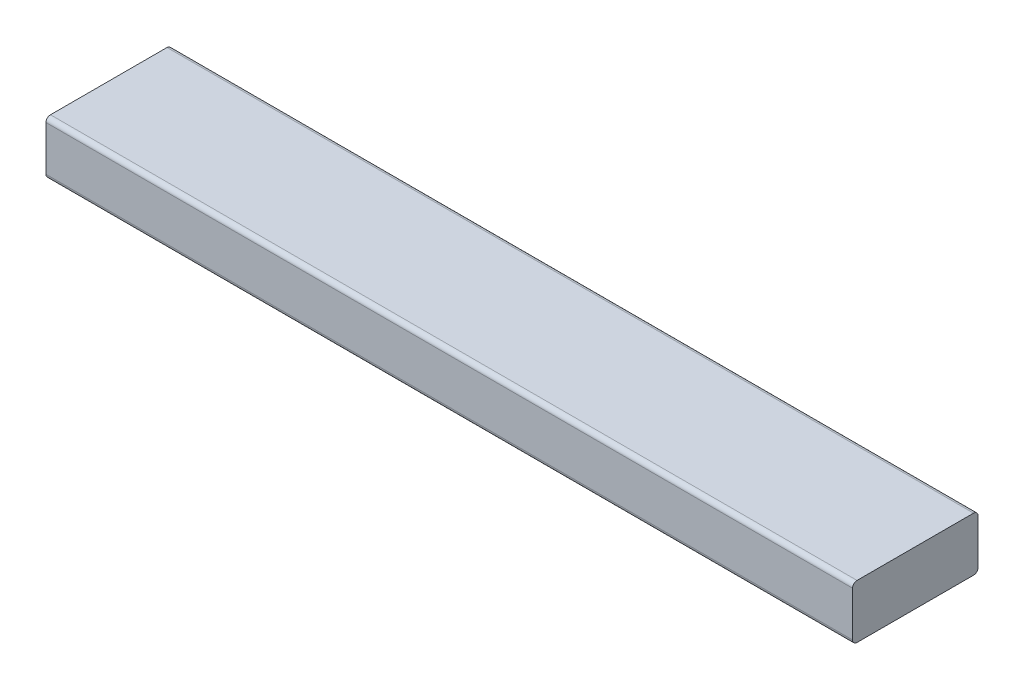
ISO-10303-21;
HEADER;
FILE_DESCRIPTION(('STEP AP214'),'2;1');
FILE_NAME('part.step','',(''),(''),'','','');
FILE_SCHEMA(('AUTOMOTIVE_DESIGN { 1 0 10303 214 1 1 1 1 }'));
ENDSEC;
DATA;
#1=APPLICATION_CONTEXT('core data for automotive mechanical design processes');
#2=APPLICATION_PROTOCOL_DEFINITION('international standard','automotive_design',2000,#1);
#3=PRODUCT_CONTEXT('',#1,'mechanical');
#4=PRODUCT('Part','Part','',(#3));
#5=PRODUCT_RELATED_PRODUCT_CATEGORY('part','',(#4));
#6=PRODUCT_DEFINITION_FORMATION('','',#4);
#7=PRODUCT_DEFINITION_CONTEXT('part definition',#1,'design');
#8=PRODUCT_DEFINITION('design','',#6,#7);
#9=PRODUCT_DEFINITION_SHAPE('','',#8);
#10=(LENGTH_UNIT() NAMED_UNIT(*) SI_UNIT(.MILLI.,.METRE.));
#11=(NAMED_UNIT(*) PLANE_ANGLE_UNIT() SI_UNIT($,.RADIAN.));
#12=(NAMED_UNIT(*) SI_UNIT($,.STERADIAN.) SOLID_ANGLE_UNIT());
#13=UNCERTAINTY_MEASURE_WITH_UNIT(LENGTH_MEASURE(1.E-05),#10,'distance_accuracy_value','');
#14=(GEOMETRIC_REPRESENTATION_CONTEXT(3) GLOBAL_UNCERTAINTY_ASSIGNED_CONTEXT((#13)) GLOBAL_UNIT_ASSIGNED_CONTEXT((#10,
#11,#12)) REPRESENTATION_CONTEXT('',''));
#15=CARTESIAN_POINT('',(0.,0.,0.));
#16=DIRECTION('',(0.,0.,1.));
#17=DIRECTION('',(1.,0.,0.));
#18=AXIS2_PLACEMENT_3D('',#15,#16,#17);
#19=CARTESIAN_POINT('',(-285.75,38.1,88.9));
#20=DIRECTION('',(1.,0.,0.));
#21=DIRECTION('',(0.,0.,-1.));
#22=AXIS2_PLACEMENT_3D('',#19,#20,#21);
#23=PLANE('',#22);
#24=DIRECTION('',(0.,-1.,0.));
#25=VECTOR('',#24,1.);
#26=CARTESIAN_POINT('',(-285.75,38.1,0.));
#27=LINE('',#26,#25);
#28=CARTESIAN_POINT('',(-285.75,34.925,0.));
#29=VERTEX_POINT('',#28);
#30=CARTESIAN_POINT('',(-285.75,3.17500000000001,0.));
#31=VERTEX_POINT('',#30);
#32=EDGE_CURVE('E166',#29,#31,#27,.T.);
#33=ORIENTED_EDGE('',*,*,#32,.T.);
#34=CARTESIAN_POINT('',(-285.75,3.175,3.175));
#35=DIRECTION('',(1.,0.,0.));
#36=DIRECTION('',(0.,0.,-1.));
#37=AXIS2_PLACEMENT_3D('',#34,#35,#36);
#38=CIRCLE('',#37,3.175);
#39=CARTESIAN_POINT('',(-285.75,0.,3.175));
#40=VERTEX_POINT('',#39);
#41=EDGE_CURVE('E140',#31,#40,#38,.F.);
#42=ORIENTED_EDGE('',*,*,#41,.T.);
#43=DIRECTION('',(0.,0.,-1.));
#44=VECTOR('',#43,1.);
#45=CARTESIAN_POINT('',(-285.75,0.,88.9));
#46=LINE('',#45,#44);
#47=CARTESIAN_POINT('',(-285.75,0.,85.725));
#48=VERTEX_POINT('',#47);
#49=EDGE_CURVE('E119',#48,#40,#46,.T.);
#50=ORIENTED_EDGE('',*,*,#49,.F.);
#51=CARTESIAN_POINT('',(-285.75,3.175,85.725));
#52=DIRECTION('',(1.,0.,0.));
#53=DIRECTION('',(0.,0.,-1.));
#54=AXIS2_PLACEMENT_3D('',#51,#52,#53);
#55=CIRCLE('',#54,3.175);
#56=CARTESIAN_POINT('',(-285.75,3.17500000000001,88.9));
#57=VERTEX_POINT('',#56);
#58=EDGE_CURVE('E124',#48,#57,#55,.F.);
#59=ORIENTED_EDGE('',*,*,#58,.T.);
#60=DIRECTION('',(0.,-1.,0.));
#61=VECTOR('',#60,1.);
#62=CARTESIAN_POINT('',(-285.75,38.1,88.9));
#63=LINE('',#62,#61);
#64=CARTESIAN_POINT('',(-285.75,34.925,88.9));
#65=VERTEX_POINT('',#64);
#66=EDGE_CURVE('E161',#65,#57,#63,.T.);
#67=ORIENTED_EDGE('',*,*,#66,.F.);
#68=CARTESIAN_POINT('',(-285.75,34.925,85.725));
#69=DIRECTION('',(1.,0.,0.));
#70=DIRECTION('',(0.,0.,-1.));
#71=AXIS2_PLACEMENT_3D('',#68,#69,#70);
#72=CIRCLE('',#71,3.175);
#73=CARTESIAN_POINT('',(-285.75,38.1,85.725));
#74=VERTEX_POINT('',#73);
#75=EDGE_CURVE('E54',#65,#74,#72,.F.);
#76=ORIENTED_EDGE('',*,*,#75,.T.);
#77=DIRECTION('',(0.,0.,-1.));
#78=VECTOR('',#77,1.);
#79=CARTESIAN_POINT('',(-285.75,38.1,88.9));
#80=LINE('',#79,#78);
#81=CARTESIAN_POINT('',(-285.75,38.1,3.175));
#82=VERTEX_POINT('',#81);
#83=EDGE_CURVE('E151',#74,#82,#80,.T.);
#84=ORIENTED_EDGE('',*,*,#83,.T.);
#85=CARTESIAN_POINT('',(-285.75,34.925,3.175));
#86=DIRECTION('',(1.,0.,0.));
#87=DIRECTION('',(0.,0.,-1.));
#88=AXIS2_PLACEMENT_3D('',#85,#86,#87);
#89=CIRCLE('',#88,3.175);
#90=EDGE_CURVE('E47',#82,#29,#89,.F.);
#91=ORIENTED_EDGE('',*,*,#90,.T.);
#92=EDGE_LOOP('',(#33,#42,#50,#59,#67,#76,#84,#91));
#93=FACE_BOUND('',#92,.T.);
#94=ADVANCED_FACE('F32',(#93),#23,.F.);
#95=CARTESIAN_POINT('',(-285.75,0.,88.9));
#96=DIRECTION('',(0.,1.,0.));
#97=DIRECTION('',(-1.,0.,0.));
#98=AXIS2_PLACEMENT_3D('',#95,#96,#97);
#99=PLANE('',#98);
#100=ORIENTED_EDGE('',*,*,#49,.T.);
#101=DIRECTION('',(1.,0.,0.));
#102=VECTOR('',#101,1.);
#103=CARTESIAN_POINT('',(-285.75,0.,3.175));
#104=LINE('',#103,#102);
#105=CARTESIAN_POINT('',(285.75,1.04982846856907E-13,3.175));
#106=VERTEX_POINT('',#105);
#107=EDGE_CURVE('E118',#40,#106,#104,.T.);
#108=ORIENTED_EDGE('',*,*,#107,.T.);
#109=DIRECTION('',(0.,0.,-1.));
#110=VECTOR('',#109,1.);
#111=CARTESIAN_POINT('',(285.75,1.04982846856907E-13,88.9));
#112=LINE('',#111,#110);
#113=CARTESIAN_POINT('',(285.75,1.04982846856907E-13,85.725));
#114=VERTEX_POINT('',#113);
#115=EDGE_CURVE('E101',#114,#106,#112,.T.);
#116=ORIENTED_EDGE('',*,*,#115,.F.);
#117=DIRECTION('',(1.,0.,0.));
#118=VECTOR('',#117,1.);
#119=CARTESIAN_POINT('',(-285.75,0.,85.725));
#120=LINE('',#119,#118);
#121=EDGE_CURVE('E115',#114,#48,#120,.F.);
#122=ORIENTED_EDGE('',*,*,#121,.T.);
#123=EDGE_LOOP('',(#100,#108,#116,#122));
#124=FACE_BOUND('',#123,.T.);
#125=ADVANCED_FACE('F114',(#124),#99,.F.);
#126=CARTESIAN_POINT('',(285.75,38.1000000000001,88.9));
#127=DIRECTION('',(-1.,0.,0.));
#128=DIRECTION('',(0.,0.,1.));
#129=AXIS2_PLACEMENT_3D('',#126,#127,#128);
#130=PLANE('',#129);
#131=ORIENTED_EDGE('',*,*,#115,.T.);
#132=CARTESIAN_POINT('',(285.75,3.1750000000001,3.175));
#133=DIRECTION('',(-1.,0.,0.));
#134=DIRECTION('',(0.,0.,1.));
#135=AXIS2_PLACEMENT_3D('',#132,#133,#134);
#136=CIRCLE('',#135,3.175);
#137=CARTESIAN_POINT('',(285.75,3.17500000000012,0.));
#138=VERTEX_POINT('',#137);
#139=EDGE_CURVE('E108',#106,#138,#136,.F.);
#140=ORIENTED_EDGE('',*,*,#139,.T.);
#141=DIRECTION('',(0.,1.,0.));
#142=VECTOR('',#141,1.);
#143=CARTESIAN_POINT('',(285.75,38.1000000000001,0.));
#144=LINE('',#143,#142);
#145=CARTESIAN_POINT('',(285.75,34.9250000000001,0.));
#146=VERTEX_POINT('',#145);
#147=EDGE_CURVE('E163',#138,#146,#144,.T.);
#148=ORIENTED_EDGE('',*,*,#147,.T.);
#149=CARTESIAN_POINT('',(285.75,34.9250000000001,3.175));
#150=DIRECTION('',(-1.,0.,0.));
#151=DIRECTION('',(0.,0.,1.));
#152=AXIS2_PLACEMENT_3D('',#149,#150,#151);
#153=CIRCLE('',#152,3.175);
#154=CARTESIAN_POINT('',(285.75,38.1000000000001,3.175));
#155=VERTEX_POINT('',#154);
#156=EDGE_CURVE('E109',#146,#155,#153,.F.);
#157=ORIENTED_EDGE('',*,*,#156,.T.);
#158=DIRECTION('',(0.,0.,-1.));
#159=VECTOR('',#158,1.);
#160=CARTESIAN_POINT('',(285.75,38.1000000000001,88.9));
#161=LINE('',#160,#159);
#162=CARTESIAN_POINT('',(285.75,38.1000000000001,85.725));
#163=VERTEX_POINT('',#162);
#164=EDGE_CURVE('E120',#163,#155,#161,.T.);
#165=ORIENTED_EDGE('',*,*,#164,.F.);
#166=CARTESIAN_POINT('',(285.75,34.9250000000001,85.725));
#167=DIRECTION('',(-1.,0.,0.));
#168=DIRECTION('',(0.,0.,1.));
#169=AXIS2_PLACEMENT_3D('',#166,#167,#168);
#170=CIRCLE('',#169,3.175);
#171=CARTESIAN_POINT('',(285.75,34.9250000000001,88.9));
#172=VERTEX_POINT('',#171);
#173=EDGE_CURVE('E126',#163,#172,#170,.F.);
#174=ORIENTED_EDGE('',*,*,#173,.T.);
#175=DIRECTION('',(0.,1.,0.));
#176=VECTOR('',#175,1.);
#177=CARTESIAN_POINT('',(285.75,38.1000000000001,88.9));
#178=LINE('',#177,#176);
#179=CARTESIAN_POINT('',(285.75,3.17500000000012,88.9));
#180=VERTEX_POINT('',#179);
#181=EDGE_CURVE('E103',#180,#172,#178,.T.);
#182=ORIENTED_EDGE('',*,*,#181,.F.);
#183=CARTESIAN_POINT('',(285.75,3.1750000000001,85.725));
#184=DIRECTION('',(-1.,0.,0.));
#185=DIRECTION('',(0.,0.,1.));
#186=AXIS2_PLACEMENT_3D('',#183,#184,#185);
#187=CIRCLE('',#186,3.175);
#188=EDGE_CURVE('E98',#180,#114,#187,.F.);
#189=ORIENTED_EDGE('',*,*,#188,.T.);
#190=EDGE_LOOP('',(#131,#140,#148,#157,#165,#174,#182,#189));
#191=FACE_BOUND('',#190,.T.);
#192=ADVANCED_FACE('F100',(#191),#130,.F.);
#193=CARTESIAN_POINT('',(-285.75,38.1,88.9));
#194=DIRECTION('',(0.,-1.,0.));
#195=DIRECTION('',(1.,0.,0.));
#196=AXIS2_PLACEMENT_3D('',#193,#194,#195);
#197=PLANE('',#196);
#198=ORIENTED_EDGE('',*,*,#164,.T.);
#199=DIRECTION('',(-1.,0.,0.));
#200=VECTOR('',#199,1.);
#201=CARTESIAN_POINT('',(-285.75,38.1,3.175));
#202=LINE('',#201,#200);
#203=EDGE_CURVE('E11',#155,#82,#202,.T.);
#204=ORIENTED_EDGE('',*,*,#203,.T.);
#205=ORIENTED_EDGE('',*,*,#83,.F.);
#206=DIRECTION('',(-1.,0.,0.));
#207=VECTOR('',#206,1.);
#208=CARTESIAN_POINT('',(285.75,38.1000000000001,85.725));
#209=LINE('',#208,#207);
#210=EDGE_CURVE('E40',#74,#163,#209,.F.);
#211=ORIENTED_EDGE('',*,*,#210,.T.);
#212=EDGE_LOOP('',(#198,#204,#205,#211));
#213=FACE_BOUND('',#212,.T.);
#214=ADVANCED_FACE('F150',(#213),#197,.F.);
#215=CARTESIAN_POINT('',(0.,0.,88.9));
#216=DIRECTION('',(0.,0.,1.));
#217=DIRECTION('',(1.,0.,0.));
#218=AXIS2_PLACEMENT_3D('',#215,#216,#217);
#219=PLANE('',#218);
#220=ORIENTED_EDGE('',*,*,#66,.T.);
#221=DIRECTION('',(1.,0.,0.));
#222=VECTOR('',#221,1.);
#223=CARTESIAN_POINT('',(285.75,3.1750000000001,88.9));
#224=LINE('',#223,#222);
#225=EDGE_CURVE('E145',#57,#180,#224,.T.);
#226=ORIENTED_EDGE('',*,*,#225,.T.);
#227=ORIENTED_EDGE('',*,*,#181,.T.);
#228=DIRECTION('',(-1.,0.,0.));
#229=VECTOR('',#228,1.);
#230=CARTESIAN_POINT('',(-285.75,34.925,88.9));
#231=LINE('',#230,#229);
#232=EDGE_CURVE('E142',#172,#65,#231,.T.);
#233=ORIENTED_EDGE('',*,*,#232,.T.);
#234=EDGE_LOOP('',(#220,#226,#227,#233));
#235=FACE_BOUND('',#234,.T.);
#236=ADVANCED_FACE('F160',(#235),#219,.T.);
#237=CARTESIAN_POINT('',(0.,0.,0.));
#238=DIRECTION('',(0.,0.,1.));
#239=DIRECTION('',(1.,0.,0.));
#240=AXIS2_PLACEMENT_3D('',#237,#238,#239);
#241=PLANE('',#240);
#242=ORIENTED_EDGE('',*,*,#147,.F.);
#243=DIRECTION('',(1.,0.,0.));
#244=VECTOR('',#243,1.);
#245=CARTESIAN_POINT('',(0.,3.17500000000005,0.));
#246=LINE('',#245,#244);
#247=EDGE_CURVE('E135',#138,#31,#246,.F.);
#248=ORIENTED_EDGE('',*,*,#247,.T.);
#249=ORIENTED_EDGE('',*,*,#32,.F.);
#250=DIRECTION('',(-1.,0.,0.));
#251=VECTOR('',#250,1.);
#252=CARTESIAN_POINT('',(0.,34.9250000000001,0.));
#253=LINE('',#252,#251);
#254=EDGE_CURVE('E133',#29,#146,#253,.F.);
#255=ORIENTED_EDGE('',*,*,#254,.T.);
#256=EDGE_LOOP('',(#242,#248,#249,#255));
#257=FACE_BOUND('',#256,.T.);
#258=ADVANCED_FACE('F174',(#257),#241,.F.);
#259=CARTESIAN_POINT('',(-285.75,3.175,3.175));
#260=DIRECTION('',(1.,0.,0.));
#261=DIRECTION('',(0.,1.,0.));
#262=AXIS2_PLACEMENT_3D('',#259,#260,#261);
#263=CYLINDRICAL_SURFACE('',#262,3.175);
#264=ORIENTED_EDGE('',*,*,#41,.F.);
#265=ORIENTED_EDGE('',*,*,#247,.F.);
#266=ORIENTED_EDGE('',*,*,#139,.F.);
#267=ORIENTED_EDGE('',*,*,#107,.F.);
#268=EDGE_LOOP('',(#264,#265,#266,#267));
#269=FACE_BOUND('',#268,.T.);
#270=ADVANCED_FACE('F182',(#269),#263,.T.);
#271=CARTESIAN_POINT('',(0.,3.17500000000005,85.725));
#272=DIRECTION('',(-1.,0.,0.));
#273=DIRECTION('',(0.,-1.,0.));
#274=AXIS2_PLACEMENT_3D('',#271,#272,#273);
#275=CYLINDRICAL_SURFACE('',#274,3.175);
#276=ORIENTED_EDGE('',*,*,#58,.F.);
#277=ORIENTED_EDGE('',*,*,#121,.F.);
#278=ORIENTED_EDGE('',*,*,#188,.F.);
#279=ORIENTED_EDGE('',*,*,#225,.F.);
#280=EDGE_LOOP('',(#276,#277,#278,#279));
#281=FACE_BOUND('',#280,.T.);
#282=ADVANCED_FACE('F123',(#281),#275,.T.);
#283=CARTESIAN_POINT('',(-285.75,34.925,3.175));
#284=DIRECTION('',(-1.,0.,0.));
#285=DIRECTION('',(0.,-1.,0.));
#286=AXIS2_PLACEMENT_3D('',#283,#284,#285);
#287=CYLINDRICAL_SURFACE('',#286,3.175);
#288=ORIENTED_EDGE('',*,*,#156,.F.);
#289=ORIENTED_EDGE('',*,*,#254,.F.);
#290=ORIENTED_EDGE('',*,*,#90,.F.);
#291=ORIENTED_EDGE('',*,*,#203,.F.);
#292=EDGE_LOOP('',(#288,#289,#290,#291));
#293=FACE_BOUND('',#292,.T.);
#294=ADVANCED_FACE('F176',(#293),#287,.T.);
#295=CARTESIAN_POINT('',(0.,34.9250000000001,85.725));
#296=DIRECTION('',(1.,0.,0.));
#297=DIRECTION('',(0.,1.,0.));
#298=AXIS2_PLACEMENT_3D('',#295,#296,#297);
#299=CYLINDRICAL_SURFACE('',#298,3.175);
#300=ORIENTED_EDGE('',*,*,#173,.F.);
#301=ORIENTED_EDGE('',*,*,#210,.F.);
#302=ORIENTED_EDGE('',*,*,#75,.F.);
#303=ORIENTED_EDGE('',*,*,#232,.F.);
#304=EDGE_LOOP('',(#300,#301,#302,#303));
#305=FACE_BOUND('',#304,.T.);
#306=ADVANCED_FACE('F34',(#305),#299,.T.);
#307=CLOSED_SHELL('',(#94,#125,#192,#214,#236,#258,#270,#282,#294,#306));
#308=MANIFOLD_SOLID_BREP('B2',#307);
#309=ADVANCED_BREP_SHAPE_REPRESENTATION('',(#18,#308),#14);
#310=SHAPE_DEFINITION_REPRESENTATION(#9,#309);
ENDSEC;
END-ISO-10303-21;
